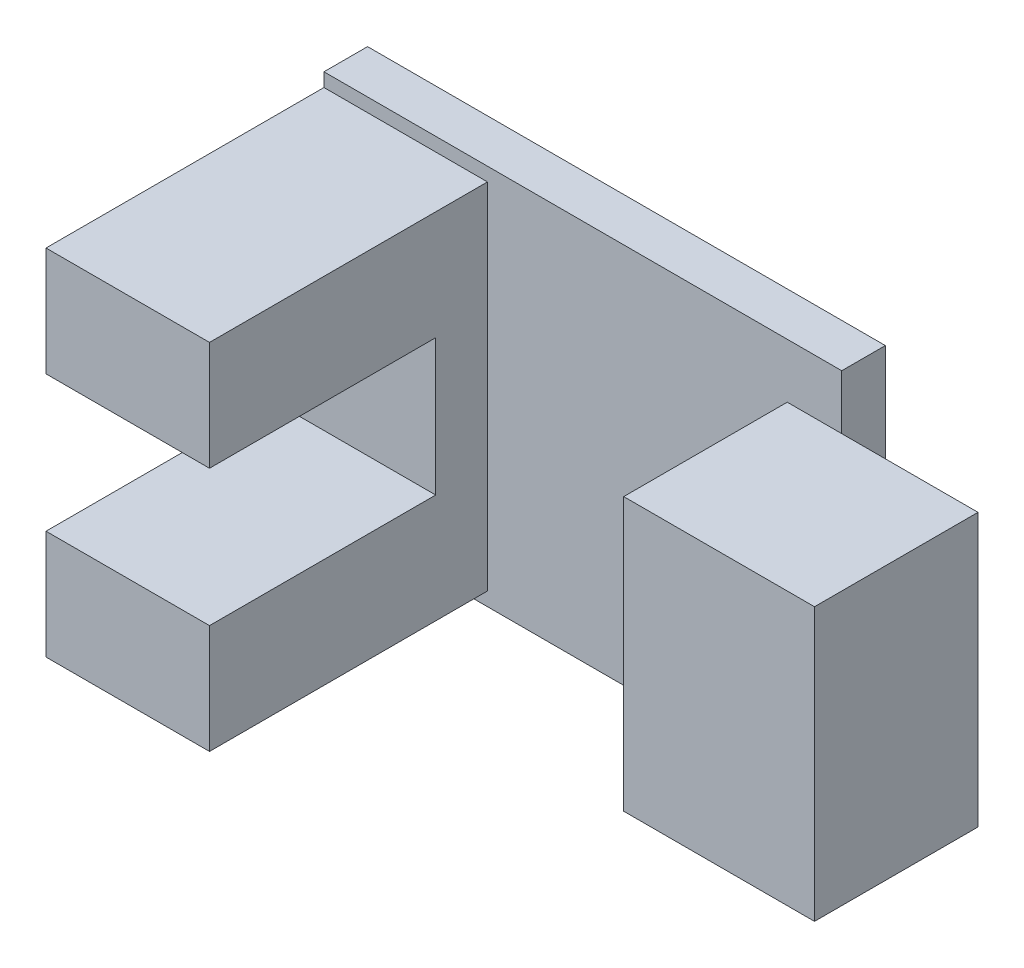
ISO-10303-21;
HEADER;
FILE_DESCRIPTION(('STEP AP214'),'2;1');
FILE_NAME('part.step','',(''),(''),'','','');
FILE_SCHEMA(('AUTOMOTIVE_DESIGN { 1 0 10303 214 1 1 1 1 }'));
ENDSEC;
DATA;
#1=APPLICATION_CONTEXT('core data for automotive mechanical design processes');
#2=APPLICATION_PROTOCOL_DEFINITION('international standard','automotive_design',2000,#1);
#3=PRODUCT_CONTEXT('',#1,'mechanical');
#4=PRODUCT('Part','Part','',(#3));
#5=PRODUCT_RELATED_PRODUCT_CATEGORY('part','',(#4));
#6=PRODUCT_DEFINITION_FORMATION('','',#4);
#7=PRODUCT_DEFINITION_CONTEXT('part definition',#1,'design');
#8=PRODUCT_DEFINITION('design','',#6,#7);
#9=PRODUCT_DEFINITION_SHAPE('','',#8);
#10=(LENGTH_UNIT() NAMED_UNIT(*) SI_UNIT(.MILLI.,.METRE.));
#11=(NAMED_UNIT(*) PLANE_ANGLE_UNIT() SI_UNIT($,.RADIAN.));
#12=(NAMED_UNIT(*) SI_UNIT($,.STERADIAN.) SOLID_ANGLE_UNIT());
#13=UNCERTAINTY_MEASURE_WITH_UNIT(LENGTH_MEASURE(1.E-05),#10,'distance_accuracy_value','');
#14=(GEOMETRIC_REPRESENTATION_CONTEXT(3) GLOBAL_UNCERTAINTY_ASSIGNED_CONTEXT((#13)) GLOBAL_UNIT_ASSIGNED_CONTEXT((#10,
#11,#12)) REPRESENTATION_CONTEXT('',''));
#15=CARTESIAN_POINT('',(0.,0.,0.));
#16=DIRECTION('',(0.,0.,1.));
#17=DIRECTION('',(1.,0.,0.));
#18=AXIS2_PLACEMENT_3D('',#15,#16,#17);
#19=CARTESIAN_POINT('',(0.,0.,7.6));
#20=DIRECTION('',(0.,0.,1.));
#21=DIRECTION('',(1.,0.,0.));
#22=AXIS2_PLACEMENT_3D('',#19,#20,#21);
#23=PLANE('',#22);
#24=DIRECTION('',(0.,1.,0.));
#25=VECTOR('',#24,1.);
#26=CARTESIAN_POINT('',(14.5,5.,7.6));
#27=LINE('',#26,#25);
#28=CARTESIAN_POINT('',(14.5,-5.,7.6));
#29=VERTEX_POINT('',#28);
#30=CARTESIAN_POINT('',(14.5,5.,7.6));
#31=VERTEX_POINT('',#30);
#32=EDGE_CURVE('E20',#29,#31,#27,.T.);
#33=ORIENTED_EDGE('',*,*,#32,.T.);
#34=DIRECTION('',(1.,0.,0.));
#35=VECTOR('',#34,1.);
#36=CARTESIAN_POINT('',(7.5,5.,7.6));
#37=LINE('',#36,#35);
#38=CARTESIAN_POINT('',(7.5,5.,7.6));
#39=VERTEX_POINT('',#38);
#40=EDGE_CURVE('E159',#31,#39,#37,.F.);
#41=ORIENTED_EDGE('',*,*,#40,.T.);
#42=DIRECTION('',(0.,1.,0.));
#43=VECTOR('',#42,1.);
#44=CARTESIAN_POINT('',(7.5,5.,7.6));
#45=LINE('',#44,#43);
#46=CARTESIAN_POINT('',(7.5,-5.,7.6));
#47=VERTEX_POINT('',#46);
#48=EDGE_CURVE('E151',#39,#47,#45,.F.);
#49=ORIENTED_EDGE('',*,*,#48,.T.);
#50=DIRECTION('',(1.,0.,0.));
#51=VECTOR('',#50,1.);
#52=CARTESIAN_POINT('',(7.5,-5.,7.6));
#53=LINE('',#52,#51);
#54=EDGE_CURVE('E134',#47,#29,#53,.T.);
#55=ORIENTED_EDGE('',*,*,#54,.T.);
#56=EDGE_LOOP('',(#33,#41,#49,#55));
#57=FACE_BOUND('',#56,.T.);
#58=ADVANCED_FACE('F17',(#57),#23,.T.);
#59=CARTESIAN_POINT('',(14.5,5.,7.6));
#60=DIRECTION('',(-1.,0.,0.));
#61=DIRECTION('',(0.,0.,1.));
#62=AXIS2_PLACEMENT_3D('',#59,#60,#61);
#63=PLANE('',#62);
#64=DIRECTION('',(0.,0.,-1.));
#65=VECTOR('',#64,1.);
#66=CARTESIAN_POINT('',(14.5,5.,7.6));
#67=LINE('',#66,#65);
#68=CARTESIAN_POINT('',(14.5,5.,1.6));
#69=VERTEX_POINT('',#68);
#70=EDGE_CURVE('E144',#69,#31,#67,.F.);
#71=ORIENTED_EDGE('',*,*,#70,.T.);
#72=ORIENTED_EDGE('',*,*,#32,.F.);
#73=DIRECTION('',(0.,0.,1.));
#74=VECTOR('',#73,1.);
#75=CARTESIAN_POINT('',(14.5,-5.,7.6));
#76=LINE('',#75,#74);
#77=CARTESIAN_POINT('',(14.5,-5.,1.6));
#78=VERTEX_POINT('',#77);
#79=EDGE_CURVE('E142',#29,#78,#76,.F.);
#80=ORIENTED_EDGE('',*,*,#79,.T.);
#81=DIRECTION('',(0.,1.,0.));
#82=VECTOR('',#81,1.);
#83=CARTESIAN_POINT('',(14.5,0.,1.6));
#84=LINE('',#83,#82);
#85=EDGE_CURVE('E199',#78,#69,#84,.T.);
#86=ORIENTED_EDGE('',*,*,#85,.T.);
#87=EDGE_LOOP('',(#71,#72,#80,#86));
#88=FACE_BOUND('',#87,.T.);
#89=ADVANCED_FACE('F140',(#88),#63,.F.);
#90=CARTESIAN_POINT('',(7.5,-5.,7.6));
#91=DIRECTION('',(0.,1.,0.));
#92=DIRECTION('',(0.,0.,1.));
#93=AXIS2_PLACEMENT_3D('',#90,#91,#92);
#94=PLANE('',#93);
#95=DIRECTION('',(1.,0.,0.));
#96=VECTOR('',#95,1.);
#97=CARTESIAN_POINT('',(0.,-5.,1.6));
#98=LINE('',#97,#96);
#99=CARTESIAN_POINT('',(9.5,-5.,1.6));
#100=VERTEX_POINT('',#99);
#101=EDGE_CURVE('E150',#100,#78,#98,.T.);
#102=ORIENTED_EDGE('',*,*,#101,.T.);
#103=ORIENTED_EDGE('',*,*,#79,.F.);
#104=ORIENTED_EDGE('',*,*,#54,.F.);
#105=DIRECTION('',(0.,0.,-1.));
#106=VECTOR('',#105,1.);
#107=CARTESIAN_POINT('',(7.5,-5.,7.6));
#108=LINE('',#107,#106);
#109=CARTESIAN_POINT('',(7.5,-5.,1.6));
#110=VERTEX_POINT('',#109);
#111=EDGE_CURVE('E156',#47,#110,#108,.T.);
#112=ORIENTED_EDGE('',*,*,#111,.T.);
#113=DIRECTION('',(1.,0.,0.));
#114=VECTOR('',#113,1.);
#115=CARTESIAN_POINT('',(0.,-5.,1.6));
#116=LINE('',#115,#114);
#117=EDGE_CURVE('E205',#100,#110,#116,.F.);
#118=ORIENTED_EDGE('',*,*,#117,.F.);
#119=EDGE_LOOP('',(#102,#103,#104,#112,#118));
#120=FACE_BOUND('',#119,.T.);
#121=ADVANCED_FACE('F148',(#120),#94,.F.);
#122=CARTESIAN_POINT('',(7.5,5.,7.6));
#123=DIRECTION('',(1.,0.,0.));
#124=DIRECTION('',(0.,0.,-1.));
#125=AXIS2_PLACEMENT_3D('',#122,#123,#124);
#126=PLANE('',#125);
#127=ORIENTED_EDGE('',*,*,#111,.F.);
#128=ORIENTED_EDGE('',*,*,#48,.F.);
#129=DIRECTION('',(0.,0.,-1.));
#130=VECTOR('',#129,1.);
#131=CARTESIAN_POINT('',(7.5,5.,7.6));
#132=LINE('',#131,#130);
#133=CARTESIAN_POINT('',(7.5,5.,1.6));
#134=VERTEX_POINT('',#133);
#135=EDGE_CURVE('E161',#39,#134,#132,.T.);
#136=ORIENTED_EDGE('',*,*,#135,.T.);
#137=DIRECTION('',(0.,1.,0.));
#138=VECTOR('',#137,1.);
#139=CARTESIAN_POINT('',(7.5,0.,1.6));
#140=LINE('',#139,#138);
#141=EDGE_CURVE('E207',#110,#134,#140,.T.);
#142=ORIENTED_EDGE('',*,*,#141,.F.);
#143=EDGE_LOOP('',(#127,#128,#136,#142));
#144=FACE_BOUND('',#143,.T.);
#145=ADVANCED_FACE('F349',(#144),#126,.F.);
#146=CARTESIAN_POINT('',(7.5,5.,7.6));
#147=DIRECTION('',(0.,-1.,0.));
#148=DIRECTION('',(0.,0.,-1.));
#149=AXIS2_PLACEMENT_3D('',#146,#147,#148);
#150=PLANE('',#149);
#151=DIRECTION('',(1.,0.,0.));
#152=VECTOR('',#151,1.);
#153=CARTESIAN_POINT('',(0.,5.,1.6));
#154=LINE('',#153,#152);
#155=CARTESIAN_POINT('',(9.5,5.,1.6));
#156=VERTEX_POINT('',#155);
#157=EDGE_CURVE('E209',#134,#156,#154,.T.);
#158=ORIENTED_EDGE('',*,*,#157,.F.);
#159=ORIENTED_EDGE('',*,*,#135,.F.);
#160=ORIENTED_EDGE('',*,*,#40,.F.);
#161=ORIENTED_EDGE('',*,*,#70,.F.);
#162=DIRECTION('',(1.,0.,0.));
#163=VECTOR('',#162,1.);
#164=CARTESIAN_POINT('',(0.,5.,1.6));
#165=LINE('',#164,#163);
#166=EDGE_CURVE('E201',#69,#156,#165,.F.);
#167=ORIENTED_EDGE('',*,*,#166,.T.);
#168=EDGE_LOOP('',(#158,#159,#160,#161,#167));
#169=FACE_BOUND('',#168,.T.);
#170=ADVANCED_FACE('F345',(#169),#150,.F.);
#171=CARTESIAN_POINT('',(-3.5,6.5,11.8));
#172=DIRECTION('',(-1.,0.,0.));
#173=DIRECTION('',(0.,0.,1.));
#174=AXIS2_PLACEMENT_3D('',#171,#172,#173);
#175=PLANE('',#174);
#176=DIRECTION('',(0.,0.,1.));
#177=VECTOR('',#176,1.);
#178=CARTESIAN_POINT('',(-3.5,-2.5,11.8));
#179=LINE('',#178,#177);
#180=CARTESIAN_POINT('',(-3.5,-2.5,3.5));
#181=VERTEX_POINT('',#180);
#182=CARTESIAN_POINT('',(-3.5,-2.5,11.8));
#183=VERTEX_POINT('',#182);
#184=EDGE_CURVE('E186',#181,#183,#179,.T.);
#185=ORIENTED_EDGE('',*,*,#184,.T.);
#186=DIRECTION('',(0.,1.,0.));
#187=VECTOR('',#186,1.);
#188=CARTESIAN_POINT('',(-3.5,0.,11.8));
#189=LINE('',#188,#187);
#190=CARTESIAN_POINT('',(-3.5,-6.5,11.8));
#191=VERTEX_POINT('',#190);
#192=EDGE_CURVE('E196',#191,#183,#189,.T.);
#193=ORIENTED_EDGE('',*,*,#192,.F.);
#194=DIRECTION('',(0.,0.,1.));
#195=VECTOR('',#194,1.);
#196=CARTESIAN_POINT('',(-3.5,-6.5,11.8));
#197=LINE('',#196,#195);
#198=CARTESIAN_POINT('',(-3.5,-6.5,1.6));
#199=VERTEX_POINT('',#198);
#200=EDGE_CURVE('E164',#191,#199,#197,.F.);
#201=ORIENTED_EDGE('',*,*,#200,.T.);
#202=DIRECTION('',(0.,1.,0.));
#203=VECTOR('',#202,1.);
#204=CARTESIAN_POINT('',(-3.5,0.,1.6));
#205=LINE('',#204,#203);
#206=CARTESIAN_POINT('',(-3.5,6.5,1.6));
#207=VERTEX_POINT('',#206);
#208=EDGE_CURVE('E214',#207,#199,#205,.F.);
#209=ORIENTED_EDGE('',*,*,#208,.F.);
#210=DIRECTION('',(0.,0.,-1.));
#211=VECTOR('',#210,1.);
#212=CARTESIAN_POINT('',(-3.5,6.5,11.8));
#213=LINE('',#212,#211);
#214=CARTESIAN_POINT('',(-3.5,6.5,11.8));
#215=VERTEX_POINT('',#214);
#216=EDGE_CURVE('E167',#207,#215,#213,.F.);
#217=ORIENTED_EDGE('',*,*,#216,.T.);
#218=DIRECTION('',(0.,1.,0.));
#219=VECTOR('',#218,1.);
#220=CARTESIAN_POINT('',(-3.5,0.,11.8));
#221=LINE('',#220,#219);
#222=CARTESIAN_POINT('',(-3.5,2.5,11.8));
#223=VERTEX_POINT('',#222);
#224=EDGE_CURVE('E170',#223,#215,#221,.T.);
#225=ORIENTED_EDGE('',*,*,#224,.F.);
#226=DIRECTION('',(0.,0.,1.));
#227=VECTOR('',#226,1.);
#228=CARTESIAN_POINT('',(-3.5,2.5,11.8));
#229=LINE('',#228,#227);
#230=CARTESIAN_POINT('',(-3.5,2.5,3.5));
#231=VERTEX_POINT('',#230);
#232=EDGE_CURVE('E174',#223,#231,#229,.F.);
#233=ORIENTED_EDGE('',*,*,#232,.T.);
#234=DIRECTION('',(0.,1.,0.));
#235=VECTOR('',#234,1.);
#236=CARTESIAN_POINT('',(-3.5,2.5,3.5));
#237=LINE('',#236,#235);
#238=EDGE_CURVE('E180',#231,#181,#237,.F.);
#239=ORIENTED_EDGE('',*,*,#238,.T.);
#240=EDGE_LOOP('',(#185,#193,#201,#209,#217,#225,#233,#239));
#241=FACE_BOUND('',#240,.T.);
#242=ADVANCED_FACE('F341',(#241),#175,.F.);
#243=CARTESIAN_POINT('',(-9.5,-6.5,11.8));
#244=DIRECTION('',(0.,1.,0.));
#245=DIRECTION('',(0.,0.,1.));
#246=AXIS2_PLACEMENT_3D('',#243,#244,#245);
#247=PLANE('',#246);
#248=ORIENTED_EDGE('',*,*,#200,.F.);
#249=DIRECTION('',(1.,0.,0.));
#250=VECTOR('',#249,1.);
#251=CARTESIAN_POINT('',(0.,-6.5,11.8));
#252=LINE('',#251,#250);
#253=CARTESIAN_POINT('',(-9.5,-6.5,11.8));
#254=VERTEX_POINT('',#253);
#255=EDGE_CURVE('E193',#254,#191,#252,.T.);
#256=ORIENTED_EDGE('',*,*,#255,.F.);
#257=DIRECTION('',(0.,0.,1.));
#258=VECTOR('',#257,1.);
#259=CARTESIAN_POINT('',(-9.5,-6.5,1.6));
#260=LINE('',#259,#258);
#261=CARTESIAN_POINT('',(-9.5,-6.5,1.6));
#262=VERTEX_POINT('',#261);
#263=EDGE_CURVE('E220',#254,#262,#260,.F.);
#264=ORIENTED_EDGE('',*,*,#263,.T.);
#265=DIRECTION('',(1.,0.,0.));
#266=VECTOR('',#265,1.);
#267=CARTESIAN_POINT('',(0.,-6.5,1.6));
#268=LINE('',#267,#266);
#269=EDGE_CURVE('E216',#199,#262,#268,.F.);
#270=ORIENTED_EDGE('',*,*,#269,.F.);
#271=EDGE_LOOP('',(#248,#256,#264,#270));
#272=FACE_BOUND('',#271,.T.);
#273=ADVANCED_FACE('F337',(#272),#247,.F.);
#274=CARTESIAN_POINT('',(-9.5,6.5,11.8));
#275=DIRECTION('',(0.,-1.,0.));
#276=DIRECTION('',(0.,0.,-1.));
#277=AXIS2_PLACEMENT_3D('',#274,#275,#276);
#278=PLANE('',#277);
#279=DIRECTION('',(0.,0.,1.));
#280=VECTOR('',#279,1.);
#281=CARTESIAN_POINT('',(-9.5,6.5,1.6));
#282=LINE('',#281,#280);
#283=CARTESIAN_POINT('',(-9.5,6.5,1.6));
#284=VERTEX_POINT('',#283);
#285=CARTESIAN_POINT('',(-9.5,6.5,11.8));
#286=VERTEX_POINT('',#285);
#287=EDGE_CURVE('E231',#284,#286,#282,.T.);
#288=ORIENTED_EDGE('',*,*,#287,.T.);
#289=DIRECTION('',(1.,0.,0.));
#290=VECTOR('',#289,1.);
#291=CARTESIAN_POINT('',(0.,6.5,11.8));
#292=LINE('',#291,#290);
#293=EDGE_CURVE('E172',#215,#286,#292,.F.);
#294=ORIENTED_EDGE('',*,*,#293,.F.);
#295=ORIENTED_EDGE('',*,*,#216,.F.);
#296=DIRECTION('',(1.,0.,0.));
#297=VECTOR('',#296,1.);
#298=CARTESIAN_POINT('',(0.,6.5,1.6));
#299=LINE('',#298,#297);
#300=EDGE_CURVE('E211',#284,#207,#299,.T.);
#301=ORIENTED_EDGE('',*,*,#300,.F.);
#302=EDGE_LOOP('',(#288,#294,#295,#301));
#303=FACE_BOUND('',#302,.T.);
#304=ADVANCED_FACE('F333',(#303),#278,.F.);
#305=CARTESIAN_POINT('',(0.,0.,11.8));
#306=DIRECTION('',(0.,0.,1.));
#307=DIRECTION('',(1.,0.,0.));
#308=AXIS2_PLACEMENT_3D('',#305,#306,#307);
#309=PLANE('',#308);
#310=ORIENTED_EDGE('',*,*,#293,.T.);
#311=DIRECTION('',(0.,1.,0.));
#312=VECTOR('',#311,1.);
#313=CARTESIAN_POINT('',(-9.5,7.,11.8));
#314=LINE('',#313,#312);
#315=CARTESIAN_POINT('',(-9.5,2.5,11.8));
#316=VERTEX_POINT('',#315);
#317=EDGE_CURVE('E234',#286,#316,#314,.F.);
#318=ORIENTED_EDGE('',*,*,#317,.T.);
#319=DIRECTION('',(-1.,0.,0.));
#320=VECTOR('',#319,1.);
#321=CARTESIAN_POINT('',(0.699999999999999,2.5,11.8));
#322=LINE('',#321,#320);
#323=EDGE_CURVE('E177',#316,#223,#322,.F.);
#324=ORIENTED_EDGE('',*,*,#323,.T.);
#325=ORIENTED_EDGE('',*,*,#224,.T.);
#326=EDGE_LOOP('',(#310,#318,#324,#325));
#327=FACE_BOUND('',#326,.T.);
#328=ADVANCED_FACE('F329',(#327),#309,.T.);
#329=CARTESIAN_POINT('',(0.699999999999999,2.5,11.8));
#330=DIRECTION('',(0.,1.,0.));
#331=DIRECTION('',(-1.,0.,0.));
#332=AXIS2_PLACEMENT_3D('',#329,#330,#331);
#333=PLANE('',#332);
#334=DIRECTION('',(0.,0.,1.));
#335=VECTOR('',#334,1.);
#336=CARTESIAN_POINT('',(-9.5,2.5,1.6));
#337=LINE('',#336,#335);
#338=CARTESIAN_POINT('',(-9.5,2.5,3.5));
#339=VERTEX_POINT('',#338);
#340=EDGE_CURVE('E237',#316,#339,#337,.F.);
#341=ORIENTED_EDGE('',*,*,#340,.T.);
#342=DIRECTION('',(-1.,0.,0.));
#343=VECTOR('',#342,1.);
#344=CARTESIAN_POINT('',(0.699999999999999,2.5,3.5));
#345=LINE('',#344,#343);
#346=EDGE_CURVE('E183',#339,#231,#345,.F.);
#347=ORIENTED_EDGE('',*,*,#346,.T.);
#348=ORIENTED_EDGE('',*,*,#232,.F.);
#349=ORIENTED_EDGE('',*,*,#323,.F.);
#350=EDGE_LOOP('',(#341,#347,#348,#349));
#351=FACE_BOUND('',#350,.T.);
#352=ADVANCED_FACE('F325',(#351),#333,.F.);
#353=CARTESIAN_POINT('',(0.699999999999999,2.5,3.5));
#354=DIRECTION('',(0.,0.,-1.));
#355=DIRECTION('',(-1.,0.,0.));
#356=AXIS2_PLACEMENT_3D('',#353,#354,#355);
#357=PLANE('',#356);
#358=DIRECTION('',(0.,1.,0.));
#359=VECTOR('',#358,1.);
#360=CARTESIAN_POINT('',(-9.5,7.,3.5));
#361=LINE('',#360,#359);
#362=CARTESIAN_POINT('',(-9.5,-2.5,3.5));
#363=VERTEX_POINT('',#362);
#364=EDGE_CURVE('E240',#339,#363,#361,.F.);
#365=ORIENTED_EDGE('',*,*,#364,.T.);
#366=DIRECTION('',(1.,0.,0.));
#367=VECTOR('',#366,1.);
#368=CARTESIAN_POINT('',(0.699999999999999,-2.5,3.5));
#369=LINE('',#368,#367);
#370=EDGE_CURVE('E188',#363,#181,#369,.T.);
#371=ORIENTED_EDGE('',*,*,#370,.T.);
#372=ORIENTED_EDGE('',*,*,#238,.F.);
#373=ORIENTED_EDGE('',*,*,#346,.F.);
#374=EDGE_LOOP('',(#365,#371,#372,#373));
#375=FACE_BOUND('',#374,.T.);
#376=ADVANCED_FACE('F321',(#375),#357,.F.);
#377=CARTESIAN_POINT('',(0.699999999999999,-2.5,11.8));
#378=DIRECTION('',(0.,-1.,0.));
#379=DIRECTION('',(1.,0.,0.));
#380=AXIS2_PLACEMENT_3D('',#377,#378,#379);
#381=PLANE('',#380);
#382=DIRECTION('',(0.,0.,1.));
#383=VECTOR('',#382,1.);
#384=CARTESIAN_POINT('',(-9.5,-2.5,1.6));
#385=LINE('',#384,#383);
#386=CARTESIAN_POINT('',(-9.5,-2.5,11.8));
#387=VERTEX_POINT('',#386);
#388=EDGE_CURVE('E243',#363,#387,#385,.T.);
#389=ORIENTED_EDGE('',*,*,#388,.T.);
#390=DIRECTION('',(1.,0.,0.));
#391=VECTOR('',#390,1.);
#392=CARTESIAN_POINT('',(0.,-2.5,11.8));
#393=LINE('',#392,#391);
#394=EDGE_CURVE('E191',#183,#387,#393,.F.);
#395=ORIENTED_EDGE('',*,*,#394,.F.);
#396=ORIENTED_EDGE('',*,*,#184,.F.);
#397=ORIENTED_EDGE('',*,*,#370,.F.);
#398=EDGE_LOOP('',(#389,#395,#396,#397));
#399=FACE_BOUND('',#398,.T.);
#400=ADVANCED_FACE('F317',(#399),#381,.F.);
#401=CARTESIAN_POINT('',(0.,0.,11.8));
#402=DIRECTION('',(0.,0.,1.));
#403=DIRECTION('',(1.,0.,0.));
#404=AXIS2_PLACEMENT_3D('',#401,#402,#403);
#405=PLANE('',#404);
#406=ORIENTED_EDGE('',*,*,#255,.T.);
#407=ORIENTED_EDGE('',*,*,#192,.T.);
#408=ORIENTED_EDGE('',*,*,#394,.T.);
#409=DIRECTION('',(0.,1.,0.));
#410=VECTOR('',#409,1.);
#411=CARTESIAN_POINT('',(-9.5,7.,11.8));
#412=LINE('',#411,#410);
#413=EDGE_CURVE('E246',#387,#254,#412,.F.);
#414=ORIENTED_EDGE('',*,*,#413,.T.);
#415=EDGE_LOOP('',(#406,#407,#408,#414));
#416=FACE_BOUND('',#415,.T.);
#417=ADVANCED_FACE('F313',(#416),#405,.T.);
#418=CARTESIAN_POINT('',(0.,0.,1.6));
#419=DIRECTION('',(0.,0.,1.));
#420=DIRECTION('',(1.,0.,0.));
#421=AXIS2_PLACEMENT_3D('',#418,#419,#420);
#422=PLANE('',#421);
#423=DIRECTION('',(0.,1.,0.));
#424=VECTOR('',#423,1.);
#425=CARTESIAN_POINT('',(9.5,7.,1.6));
#426=LINE('',#425,#424);
#427=EDGE_CURVE('E258',#100,#156,#426,.T.);
#428=ORIENTED_EDGE('',*,*,#427,.T.);
#429=ORIENTED_EDGE('',*,*,#166,.F.);
#430=ORIENTED_EDGE('',*,*,#85,.F.);
#431=ORIENTED_EDGE('',*,*,#101,.F.);
#432=EDGE_LOOP('',(#428,#429,#430,#431));
#433=FACE_BOUND('',#432,.T.);
#434=ADVANCED_FACE('F309',(#433),#422,.F.);
#435=CARTESIAN_POINT('',(0.,0.,1.6));
#436=DIRECTION('',(0.,0.,1.));
#437=DIRECTION('',(1.,0.,0.));
#438=AXIS2_PLACEMENT_3D('',#435,#436,#437);
#439=PLANE('',#438);
#440=DIRECTION('',(0.,1.,0.));
#441=VECTOR('',#440,1.);
#442=CARTESIAN_POINT('',(-9.5,7.,1.6));
#443=LINE('',#442,#441);
#444=CARTESIAN_POINT('',(-9.5,-7.,1.6));
#445=VERTEX_POINT('',#444);
#446=EDGE_CURVE('E223',#262,#445,#443,.F.);
#447=ORIENTED_EDGE('',*,*,#446,.T.);
#448=DIRECTION('',(1.,0.,0.));
#449=VECTOR('',#448,1.);
#450=CARTESIAN_POINT('',(-9.5,-7.,1.6));
#451=LINE('',#450,#449);
#452=CARTESIAN_POINT('',(9.5,-7.,1.6));
#453=VERTEX_POINT('',#452);
#454=EDGE_CURVE('E252',#445,#453,#451,.T.);
#455=ORIENTED_EDGE('',*,*,#454,.T.);
#456=DIRECTION('',(0.,1.,0.));
#457=VECTOR('',#456,1.);
#458=CARTESIAN_POINT('',(9.5,7.,1.6));
#459=LINE('',#458,#457);
#460=EDGE_CURVE('E255',#453,#100,#459,.T.);
#461=ORIENTED_EDGE('',*,*,#460,.T.);
#462=ORIENTED_EDGE('',*,*,#117,.T.);
#463=ORIENTED_EDGE('',*,*,#141,.T.);
#464=ORIENTED_EDGE('',*,*,#157,.T.);
#465=DIRECTION('',(0.,1.,0.));
#466=VECTOR('',#465,1.);
#467=CARTESIAN_POINT('',(9.5,7.,1.6));
#468=LINE('',#467,#466);
#469=CARTESIAN_POINT('',(9.5,7.,1.6));
#470=VERTEX_POINT('',#469);
#471=EDGE_CURVE('E261',#156,#470,#468,.T.);
#472=ORIENTED_EDGE('',*,*,#471,.T.);
#473=DIRECTION('',(1.,0.,0.));
#474=VECTOR('',#473,1.);
#475=CARTESIAN_POINT('',(-9.5,7.,1.6));
#476=LINE('',#475,#474);
#477=CARTESIAN_POINT('',(-9.5,7.,1.6));
#478=VERTEX_POINT('',#477);
#479=EDGE_CURVE('E218',#470,#478,#476,.F.);
#480=ORIENTED_EDGE('',*,*,#479,.T.);
#481=DIRECTION('',(0.,1.,0.));
#482=VECTOR('',#481,1.);
#483=CARTESIAN_POINT('',(-9.5,7.,1.6));
#484=LINE('',#483,#482);
#485=EDGE_CURVE('E228',#478,#284,#484,.F.);
#486=ORIENTED_EDGE('',*,*,#485,.T.);
#487=ORIENTED_EDGE('',*,*,#300,.T.);
#488=ORIENTED_EDGE('',*,*,#208,.T.);
#489=ORIENTED_EDGE('',*,*,#269,.T.);
#490=EDGE_LOOP('',(#447,#455,#461,#462,#463,#464,#472,#480,#486,#487,#488,#489));
#491=FACE_BOUND('',#490,.T.);
#492=ADVANCED_FACE('F306',(#491),#439,.T.);
#493=CARTESIAN_POINT('',(-9.5,7.,1.6));
#494=DIRECTION('',(0.,-1.,0.));
#495=DIRECTION('',(0.,0.,-1.));
#496=AXIS2_PLACEMENT_3D('',#493,#494,#495);
#497=PLANE('',#496);
#498=DIRECTION('',(0.,0.,1.));
#499=VECTOR('',#498,1.);
#500=CARTESIAN_POINT('',(-9.5,7.,1.6));
#501=LINE('',#500,#499);
#502=CARTESIAN_POINT('',(-9.5,7.,0.));
#503=VERTEX_POINT('',#502);
#504=EDGE_CURVE('E225',#503,#478,#501,.T.);
#505=ORIENTED_EDGE('',*,*,#504,.T.);
#506=ORIENTED_EDGE('',*,*,#479,.F.);
#507=DIRECTION('',(0.,0.,1.));
#508=VECTOR('',#507,1.);
#509=CARTESIAN_POINT('',(9.5,7.,1.6));
#510=LINE('',#509,#508);
#511=CARTESIAN_POINT('',(9.5,7.,0.));
#512=VERTEX_POINT('',#511);
#513=EDGE_CURVE('E264',#470,#512,#510,.F.);
#514=ORIENTED_EDGE('',*,*,#513,.T.);
#515=DIRECTION('',(1.,0.,0.));
#516=VECTOR('',#515,1.);
#517=CARTESIAN_POINT('',(0.,7.,0.));
#518=LINE('',#517,#516);
#519=EDGE_CURVE('E267',#512,#503,#518,.F.);
#520=ORIENTED_EDGE('',*,*,#519,.T.);
#521=EDGE_LOOP('',(#505,#506,#514,#520));
#522=FACE_BOUND('',#521,.T.);
#523=ADVANCED_FACE('F288',(#522),#497,.F.);
#524=CARTESIAN_POINT('',(-9.5,7.,1.6));
#525=DIRECTION('',(1.,0.,0.));
#526=DIRECTION('',(0.,1.,0.));
#527=AXIS2_PLACEMENT_3D('',#524,#525,#526);
#528=PLANE('',#527);
#529=ORIENTED_EDGE('',*,*,#388,.F.);
#530=ORIENTED_EDGE('',*,*,#364,.F.);
#531=ORIENTED_EDGE('',*,*,#340,.F.);
#532=ORIENTED_EDGE('',*,*,#317,.F.);
#533=ORIENTED_EDGE('',*,*,#287,.F.);
#534=ORIENTED_EDGE('',*,*,#485,.F.);
#535=ORIENTED_EDGE('',*,*,#504,.F.);
#536=DIRECTION('',(0.,1.,0.));
#537=VECTOR('',#536,1.);
#538=CARTESIAN_POINT('',(-9.5,0.,0.));
#539=LINE('',#538,#537);
#540=CARTESIAN_POINT('',(-9.5,-7.,0.));
#541=VERTEX_POINT('',#540);
#542=EDGE_CURVE('E270',#503,#541,#539,.F.);
#543=ORIENTED_EDGE('',*,*,#542,.T.);
#544=DIRECTION('',(0.,0.,1.));
#545=VECTOR('',#544,1.);
#546=CARTESIAN_POINT('',(-9.5,-7.,1.6));
#547=LINE('',#546,#545);
#548=EDGE_CURVE('E249',#541,#445,#547,.T.);
#549=ORIENTED_EDGE('',*,*,#548,.T.);
#550=ORIENTED_EDGE('',*,*,#446,.F.);
#551=ORIENTED_EDGE('',*,*,#263,.F.);
#552=ORIENTED_EDGE('',*,*,#413,.F.);
#553=EDGE_LOOP('',(#529,#530,#531,#532,#533,#534,#535,#543,#549,#550,#551,#552));
#554=FACE_BOUND('',#553,.T.);
#555=ADVANCED_FACE('F283',(#554),#528,.F.);
#556=CARTESIAN_POINT('',(-9.5,-7.,1.6));
#557=DIRECTION('',(0.,1.,0.));
#558=DIRECTION('',(0.,0.,1.));
#559=AXIS2_PLACEMENT_3D('',#556,#557,#558);
#560=PLANE('',#559);
#561=DIRECTION('',(0.,0.,1.));
#562=VECTOR('',#561,1.);
#563=CARTESIAN_POINT('',(9.5,-7.,1.6));
#564=LINE('',#563,#562);
#565=CARTESIAN_POINT('',(9.5,-7.,0.));
#566=VERTEX_POINT('',#565);
#567=EDGE_CURVE('E34',#566,#453,#564,.T.);
#568=ORIENTED_EDGE('',*,*,#567,.T.);
#569=ORIENTED_EDGE('',*,*,#454,.F.);
#570=ORIENTED_EDGE('',*,*,#548,.F.);
#571=DIRECTION('',(1.,0.,0.));
#572=VECTOR('',#571,1.);
#573=CARTESIAN_POINT('',(0.,-7.,0.));
#574=LINE('',#573,#572);
#575=EDGE_CURVE('E26',#541,#566,#574,.T.);
#576=ORIENTED_EDGE('',*,*,#575,.T.);
#577=EDGE_LOOP('',(#568,#569,#570,#576));
#578=FACE_BOUND('',#577,.T.);
#579=ADVANCED_FACE('F276',(#578),#560,.F.);
#580=CARTESIAN_POINT('',(9.5,7.,1.6));
#581=DIRECTION('',(-1.,0.,0.));
#582=DIRECTION('',(0.,0.,1.));
#583=AXIS2_PLACEMENT_3D('',#580,#581,#582);
#584=PLANE('',#583);
#585=ORIENTED_EDGE('',*,*,#513,.F.);
#586=ORIENTED_EDGE('',*,*,#471,.F.);
#587=ORIENTED_EDGE('',*,*,#427,.F.);
#588=ORIENTED_EDGE('',*,*,#460,.F.);
#589=ORIENTED_EDGE('',*,*,#567,.F.);
#590=DIRECTION('',(0.,1.,0.));
#591=VECTOR('',#590,1.);
#592=CARTESIAN_POINT('',(9.5,0.,0.));
#593=LINE('',#592,#591);
#594=EDGE_CURVE('E11',#566,#512,#593,.T.);
#595=ORIENTED_EDGE('',*,*,#594,.T.);
#596=EDGE_LOOP('',(#585,#586,#587,#588,#589,#595));
#597=FACE_BOUND('',#596,.T.);
#598=ADVANCED_FACE('F291',(#597),#584,.F.);
#599=CARTESIAN_POINT('',(0.,0.,0.));
#600=DIRECTION('',(0.,0.,1.));
#601=DIRECTION('',(1.,0.,0.));
#602=AXIS2_PLACEMENT_3D('',#599,#600,#601);
#603=PLANE('',#602);
#604=ORIENTED_EDGE('',*,*,#575,.F.);
#605=ORIENTED_EDGE('',*,*,#542,.F.);
#606=ORIENTED_EDGE('',*,*,#519,.F.);
#607=ORIENTED_EDGE('',*,*,#594,.F.);
#608=EDGE_LOOP('',(#604,#605,#606,#607));
#609=FACE_BOUND('',#608,.T.);
#610=ADVANCED_FACE('F280',(#609),#603,.F.);
#611=CLOSED_SHELL('',(#58,#89,#121,#145,#170,#242,#273,#304,#328,#352,#376,#400,#417,#434,#492,
#523,#555,#579,#598,#610));
#612=MANIFOLD_SOLID_BREP('B1',#611);
#613=ADVANCED_BREP_SHAPE_REPRESENTATION('',(#18,#612),#14);
#614=SHAPE_DEFINITION_REPRESENTATION(#9,#613);
ENDSEC;
END-ISO-10303-21;
